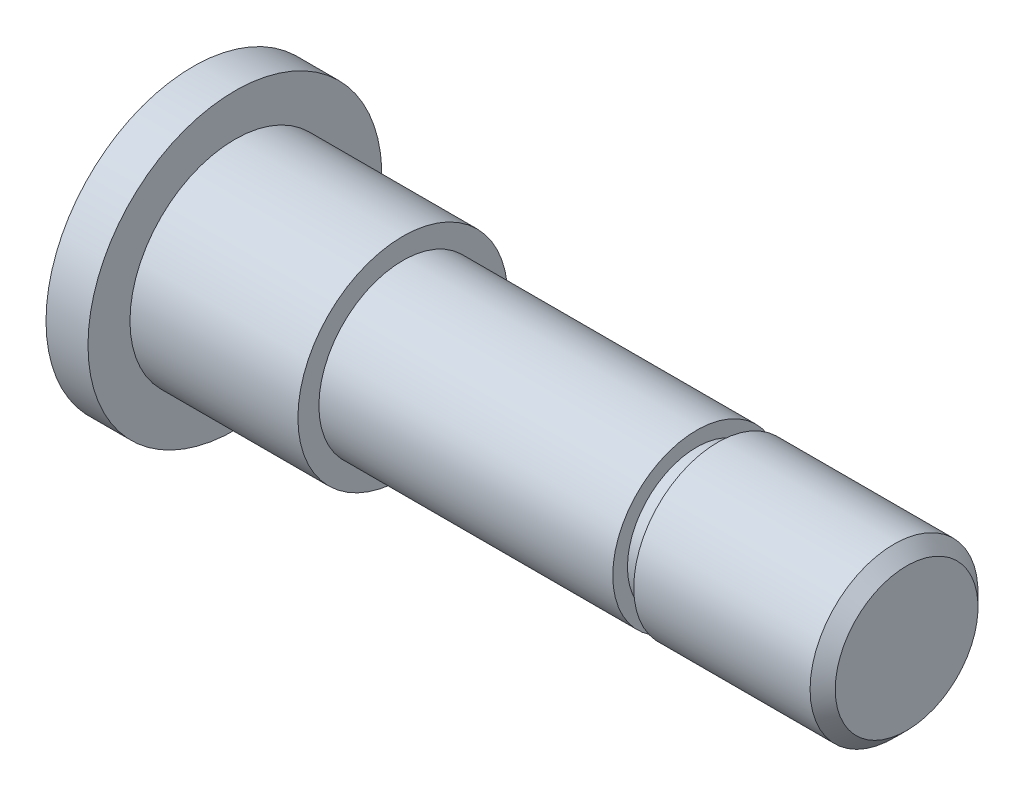
ISO-10303-21;
HEADER;
FILE_DESCRIPTION(('STEP AP214'),'2;1');
FILE_NAME('part.step','',(''),(''),'','','');
FILE_SCHEMA(('AUTOMOTIVE_DESIGN { 1 0 10303 214 1 1 1 1 }'));
ENDSEC;
DATA;
#1=APPLICATION_CONTEXT('core data for automotive mechanical design processes');
#2=APPLICATION_PROTOCOL_DEFINITION('international standard','automotive_design',2000,#1);
#3=PRODUCT_CONTEXT('',#1,'mechanical');
#4=PRODUCT('Part','Part','',(#3));
#5=PRODUCT_RELATED_PRODUCT_CATEGORY('part','',(#4));
#6=PRODUCT_DEFINITION_FORMATION('','',#4);
#7=PRODUCT_DEFINITION_CONTEXT('part definition',#1,'design');
#8=PRODUCT_DEFINITION('design','',#6,#7);
#9=PRODUCT_DEFINITION_SHAPE('','',#8);
#10=(LENGTH_UNIT() NAMED_UNIT(*) SI_UNIT(.MILLI.,.METRE.));
#11=(NAMED_UNIT(*) PLANE_ANGLE_UNIT() SI_UNIT($,.RADIAN.));
#12=(NAMED_UNIT(*) SI_UNIT($,.STERADIAN.) SOLID_ANGLE_UNIT());
#13=UNCERTAINTY_MEASURE_WITH_UNIT(LENGTH_MEASURE(1.E-05),#10,'distance_accuracy_value','');
#14=(GEOMETRIC_REPRESENTATION_CONTEXT(3) GLOBAL_UNCERTAINTY_ASSIGNED_CONTEXT((#13)) GLOBAL_UNIT_ASSIGNED_CONTEXT((#10,
#11,#12)) REPRESENTATION_CONTEXT('',''));
#15=CARTESIAN_POINT('',(0.,0.,0.));
#16=DIRECTION('',(0.,0.,1.));
#17=DIRECTION('',(1.,0.,0.));
#18=AXIS2_PLACEMENT_3D('',#15,#16,#17);
#19=CARTESIAN_POINT('',(0.,0.,0.));
#20=DIRECTION('',(1.,0.,0.));
#21=DIRECTION('',(0.,0.,-1.));
#22=AXIS2_PLACEMENT_3D('',#19,#20,#21);
#23=PLANE('',#22);
#24=CARTESIAN_POINT('',(0.,0.,0.));
#25=DIRECTION('',(-1.,0.,0.));
#26=DIRECTION('',(0.,0.,1.));
#27=AXIS2_PLACEMENT_3D('',#24,#25,#26);
#28=CIRCLE('',#27,7.);
#29=CARTESIAN_POINT('',(0.,0.,7.));
#30=VERTEX_POINT('',#29);
#31=EDGE_CURVE('E41',#30,#30,#28,.T.);
#32=ORIENTED_EDGE('',*,*,#31,.T.);
#33=EDGE_LOOP('',(#32));
#34=FACE_BOUND('',#33,.T.);
#35=ADVANCED_FACE('F31',(#34),#23,.F.);
#36=CARTESIAN_POINT('',(-12.5747225647349,0.,0.));
#37=DIRECTION('',(-1.,0.,0.));
#38=DIRECTION('',(0.,0.,1.));
#39=AXIS2_PLACEMENT_3D('',#36,#37,#38);
#40=CYLINDRICAL_SURFACE('',#39,7.);
#41=ORIENTED_EDGE('',*,*,#31,.F.);
#42=EDGE_LOOP('',(#41));
#43=FACE_BOUND('',#42,.T.);
#44=CARTESIAN_POINT('',(2.,0.,0.));
#45=DIRECTION('',(-1.,0.,0.));
#46=DIRECTION('',(0.,0.,1.));
#47=AXIS2_PLACEMENT_3D('',#44,#45,#46);
#48=CIRCLE('',#47,7.);
#49=CARTESIAN_POINT('',(2.,0.,7.));
#50=VERTEX_POINT('',#49);
#51=EDGE_CURVE('E45',#50,#50,#48,.T.);
#52=ORIENTED_EDGE('',*,*,#51,.T.);
#53=EDGE_LOOP('',(#52));
#54=FACE_BOUND('',#53,.T.);
#55=ADVANCED_FACE('F88',(#43,#54),#40,.T.);
#56=CARTESIAN_POINT('',(2.,7.,0.));
#57=DIRECTION('',(-1.,0.,0.));
#58=DIRECTION('',(0.,0.,1.));
#59=AXIS2_PLACEMENT_3D('',#56,#57,#58);
#60=PLANE('',#59);
#61=ORIENTED_EDGE('',*,*,#51,.F.);
#62=EDGE_LOOP('',(#61));
#63=FACE_BOUND('',#62,.T.);
#64=CARTESIAN_POINT('',(2.,0.,0.));
#65=DIRECTION('',(-1.,0.,0.));
#66=DIRECTION('',(0.,0.,1.));
#67=AXIS2_PLACEMENT_3D('',#64,#65,#66);
#68=CIRCLE('',#67,5.);
#69=CARTESIAN_POINT('',(2.,0.,5.));
#70=VERTEX_POINT('',#69);
#71=EDGE_CURVE('E50',#70,#70,#68,.T.);
#72=ORIENTED_EDGE('',*,*,#71,.T.);
#73=EDGE_LOOP('',(#72));
#74=FACE_BOUND('',#73,.T.);
#75=ADVANCED_FACE('F93',(#63,#74),#60,.F.);
#76=CARTESIAN_POINT('',(-12.5747225647349,0.,0.));
#77=DIRECTION('',(-1.,0.,0.));
#78=DIRECTION('',(0.,0.,1.));
#79=AXIS2_PLACEMENT_3D('',#76,#77,#78);
#80=CYLINDRICAL_SURFACE('',#79,5.);
#81=ORIENTED_EDGE('',*,*,#71,.F.);
#82=EDGE_LOOP('',(#81));
#83=FACE_BOUND('',#82,.T.);
#84=CARTESIAN_POINT('',(10.,0.,0.));
#85=DIRECTION('',(-1.,0.,0.));
#86=DIRECTION('',(0.,0.,1.));
#87=AXIS2_PLACEMENT_3D('',#84,#85,#86);
#88=CIRCLE('',#87,5.);
#89=CARTESIAN_POINT('',(10.,0.,5.));
#90=VERTEX_POINT('',#89);
#91=EDGE_CURVE('E53',#90,#90,#88,.T.);
#92=ORIENTED_EDGE('',*,*,#91,.T.);
#93=EDGE_LOOP('',(#92));
#94=FACE_BOUND('',#93,.T.);
#95=ADVANCED_FACE('F101',(#83,#94),#80,.T.);
#96=CARTESIAN_POINT('',(10.,5.,0.));
#97=DIRECTION('',(-1.,0.,0.));
#98=DIRECTION('',(0.,0.,1.));
#99=AXIS2_PLACEMENT_3D('',#96,#97,#98);
#100=PLANE('',#99);
#101=ORIENTED_EDGE('',*,*,#91,.F.);
#102=EDGE_LOOP('',(#101));
#103=FACE_BOUND('',#102,.T.);
#104=CARTESIAN_POINT('',(10.,0.,0.));
#105=DIRECTION('',(-1.,0.,0.));
#106=DIRECTION('',(0.,0.,1.));
#107=AXIS2_PLACEMENT_3D('',#104,#105,#106);
#108=CIRCLE('',#107,4.);
#109=CARTESIAN_POINT('',(10.,0.,4.));
#110=VERTEX_POINT('',#109);
#111=EDGE_CURVE('E56',#110,#110,#108,.T.);
#112=ORIENTED_EDGE('',*,*,#111,.T.);
#113=EDGE_LOOP('',(#112));
#114=FACE_BOUND('',#113,.T.);
#115=ADVANCED_FACE('F107',(#103,#114),#100,.F.);
#116=CARTESIAN_POINT('',(-12.5747225647349,0.,0.));
#117=DIRECTION('',(-1.,0.,0.));
#118=DIRECTION('',(0.,0.,1.));
#119=AXIS2_PLACEMENT_3D('',#116,#117,#118);
#120=CYLINDRICAL_SURFACE('',#119,4.);
#121=ORIENTED_EDGE('',*,*,#111,.F.);
#122=EDGE_LOOP('',(#121));
#123=FACE_BOUND('',#122,.T.);
#124=CARTESIAN_POINT('',(24.,0.,0.));
#125=DIRECTION('',(-1.,0.,0.));
#126=DIRECTION('',(0.,0.,1.));
#127=AXIS2_PLACEMENT_3D('',#124,#125,#126);
#128=CIRCLE('',#127,4.);
#129=CARTESIAN_POINT('',(24.,0.,4.));
#130=VERTEX_POINT('',#129);
#131=EDGE_CURVE('E59',#130,#130,#128,.T.);
#132=ORIENTED_EDGE('',*,*,#131,.T.);
#133=EDGE_LOOP('',(#132));
#134=FACE_BOUND('',#133,.T.);
#135=ADVANCED_FACE('F113',(#123,#134),#120,.T.);
#136=CARTESIAN_POINT('',(24.,4.,0.));
#137=DIRECTION('',(-1.,0.,0.));
#138=DIRECTION('',(0.,0.,1.));
#139=AXIS2_PLACEMENT_3D('',#136,#137,#138);
#140=PLANE('',#139);
#141=ORIENTED_EDGE('',*,*,#131,.F.);
#142=EDGE_LOOP('',(#141));
#143=FACE_BOUND('',#142,.T.);
#144=CARTESIAN_POINT('',(24.,0.,0.));
#145=DIRECTION('',(-1.,0.,0.));
#146=DIRECTION('',(0.,0.,1.));
#147=AXIS2_PLACEMENT_3D('',#144,#145,#146);
#148=CIRCLE('',#147,3.3);
#149=CARTESIAN_POINT('',(24.,0.,3.3));
#150=VERTEX_POINT('',#149);
#151=EDGE_CURVE('E62',#150,#150,#148,.T.);
#152=ORIENTED_EDGE('',*,*,#151,.T.);
#153=EDGE_LOOP('',(#152));
#154=FACE_BOUND('',#153,.T.);
#155=ADVANCED_FACE('F119',(#143,#154),#140,.F.);
#156=CARTESIAN_POINT('',(-12.5747225647349,0.,0.));
#157=DIRECTION('',(-1.,0.,0.));
#158=DIRECTION('',(0.,0.,1.));
#159=AXIS2_PLACEMENT_3D('',#156,#157,#158);
#160=CYLINDRICAL_SURFACE('',#159,3.3);
#161=ORIENTED_EDGE('',*,*,#151,.F.);
#162=EDGE_LOOP('',(#161));
#163=FACE_BOUND('',#162,.T.);
#164=CARTESIAN_POINT('',(25.,0.,0.));
#165=DIRECTION('',(-1.,0.,0.));
#166=DIRECTION('',(0.,0.,1.));
#167=AXIS2_PLACEMENT_3D('',#164,#165,#166);
#168=CIRCLE('',#167,3.3);
#169=CARTESIAN_POINT('',(25.,0.,3.3));
#170=VERTEX_POINT('',#169);
#171=EDGE_CURVE('E65',#170,#170,#168,.T.);
#172=ORIENTED_EDGE('',*,*,#171,.T.);
#173=EDGE_LOOP('',(#172));
#174=FACE_BOUND('',#173,.T.);
#175=ADVANCED_FACE('F84',(#163,#174),#160,.T.);
#176=CARTESIAN_POINT('',(25.,3.3,0.));
#177=DIRECTION('',(1.,0.,0.));
#178=DIRECTION('',(0.,0.,-1.));
#179=AXIS2_PLACEMENT_3D('',#176,#177,#178);
#180=PLANE('',#179);
#181=ORIENTED_EDGE('',*,*,#171,.F.);
#182=EDGE_LOOP('',(#181));
#183=FACE_BOUND('',#182,.T.);
#184=CARTESIAN_POINT('',(25.,0.,0.));
#185=DIRECTION('',(-1.,0.,0.));
#186=DIRECTION('',(0.,0.,1.));
#187=AXIS2_PLACEMENT_3D('',#184,#185,#186);
#188=CIRCLE('',#187,4.);
#189=CARTESIAN_POINT('',(25.,0.,4.));
#190=VERTEX_POINT('',#189);
#191=EDGE_CURVE('E68',#190,#190,#188,.T.);
#192=ORIENTED_EDGE('',*,*,#191,.T.);
#193=EDGE_LOOP('',(#192));
#194=FACE_BOUND('',#193,.T.);
#195=ADVANCED_FACE('F72',(#183,#194),#180,.F.);
#196=CARTESIAN_POINT('',(-12.5747225647349,0.,0.));
#197=DIRECTION('',(-1.,0.,0.));
#198=DIRECTION('',(0.,0.,1.));
#199=AXIS2_PLACEMENT_3D('',#196,#197,#198);
#200=CYLINDRICAL_SURFACE('',#199,4.);
#201=CARTESIAN_POINT('',(33.4,0.,0.));
#202=DIRECTION('',(-1.,0.,0.));
#203=DIRECTION('',(0.,0.,1.));
#204=AXIS2_PLACEMENT_3D('',#201,#202,#203);
#205=CIRCLE('',#204,4.);
#206=CARTESIAN_POINT('',(33.4,0.,4.));
#207=VERTEX_POINT('',#206);
#208=EDGE_CURVE('E37',#207,#207,#205,.T.);
#209=ORIENTED_EDGE('',*,*,#208,.T.);
#210=EDGE_LOOP('',(#209));
#211=FACE_BOUND('',#210,.T.);
#212=ORIENTED_EDGE('',*,*,#191,.F.);
#213=EDGE_LOOP('',(#212));
#214=FACE_BOUND('',#213,.T.);
#215=ADVANCED_FACE('F74',(#211,#214),#200,.T.);
#216=CARTESIAN_POINT('',(34.,4.,0.));
#217=DIRECTION('',(-1.,0.,0.));
#218=DIRECTION('',(0.,0.,1.));
#219=AXIS2_PLACEMENT_3D('',#216,#217,#218);
#220=PLANE('',#219);
#221=CARTESIAN_POINT('',(34.,0.,0.));
#222=DIRECTION('',(-1.,0.,0.));
#223=DIRECTION('',(0.,0.,1.));
#224=AXIS2_PLACEMENT_3D('',#221,#222,#223);
#225=CIRCLE('',#224,3.4);
#226=CARTESIAN_POINT('',(34.,0.,3.4));
#227=VERTEX_POINT('',#226);
#228=EDGE_CURVE('E10',#227,#227,#225,.F.);
#229=ORIENTED_EDGE('',*,*,#228,.T.);
#230=EDGE_LOOP('',(#229));
#231=FACE_BOUND('',#230,.T.);
#232=ADVANCED_FACE('F76',(#231),#220,.F.);
#233=CARTESIAN_POINT('',(33.4,0.,0.));
#234=DIRECTION('',(-1.,0.,0.));
#235=DIRECTION('',(0.,0.,1.));
#236=AXIS2_PLACEMENT_3D('',#233,#234,#235);
#237=CONICAL_SURFACE('',#236,4.,0.785398163397446);
#238=ORIENTED_EDGE('',*,*,#228,.F.);
#239=EDGE_LOOP('',(#238));
#240=FACE_BOUND('',#239,.T.);
#241=ORIENTED_EDGE('',*,*,#208,.F.);
#242=EDGE_LOOP('',(#241));
#243=FACE_BOUND('',#242,.T.);
#244=ADVANCED_FACE('F82',(#240,#243),#237,.T.);
#245=CLOSED_SHELL('',(#35,#55,#75,#95,#115,#135,#155,#175,#195,#215,#232,#244));
#246=MANIFOLD_SOLID_BREP('B2',#245);
#247=ADVANCED_BREP_SHAPE_REPRESENTATION('',(#18,#246),#14);
#248=SHAPE_DEFINITION_REPRESENTATION(#9,#247);
ENDSEC;
END-ISO-10303-21;
